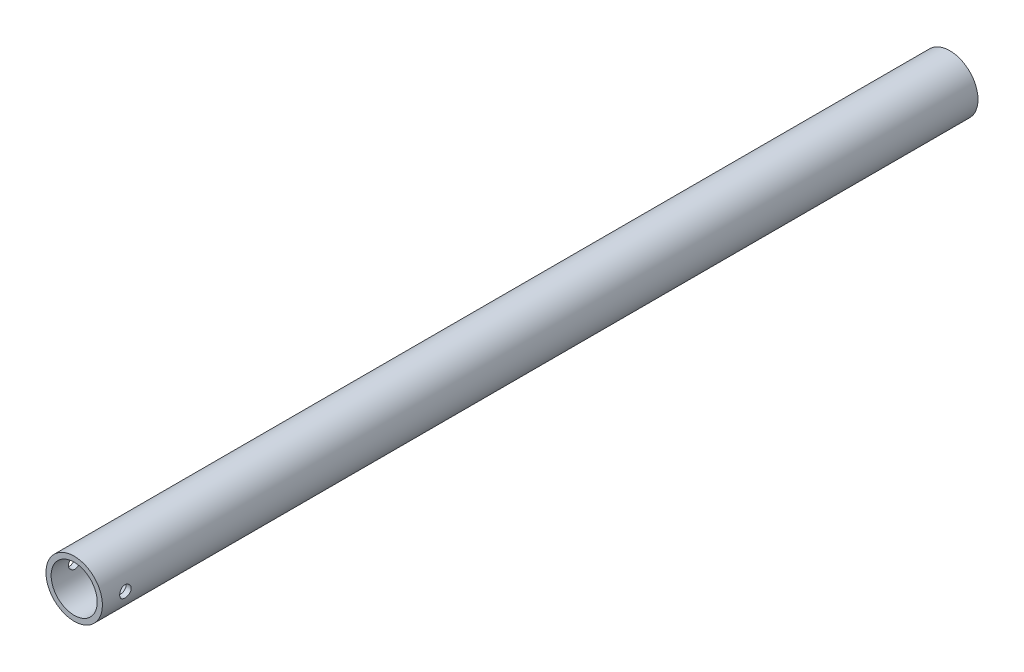
ISO-10303-21;
HEADER;
FILE_DESCRIPTION(('STEP AP214'),'2;1');
FILE_NAME('part.step','',(''),(''),'','','');
FILE_SCHEMA(('AUTOMOTIVE_DESIGN { 1 0 10303 214 1 1 1 1 }'));
ENDSEC;
DATA;
#1=APPLICATION_CONTEXT('core data for automotive mechanical design processes');
#2=APPLICATION_PROTOCOL_DEFINITION('international standard','automotive_design',2000,#1);
#3=PRODUCT_CONTEXT('',#1,'mechanical');
#4=PRODUCT('Part','Part','',(#3));
#5=PRODUCT_RELATED_PRODUCT_CATEGORY('part','',(#4));
#6=PRODUCT_DEFINITION_FORMATION('','',#4);
#7=PRODUCT_DEFINITION_CONTEXT('part definition',#1,'design');
#8=PRODUCT_DEFINITION('design','',#6,#7);
#9=PRODUCT_DEFINITION_SHAPE('','',#8);
#10=(LENGTH_UNIT() NAMED_UNIT(*) SI_UNIT(.MILLI.,.METRE.));
#11=(NAMED_UNIT(*) PLANE_ANGLE_UNIT() SI_UNIT($,.RADIAN.));
#12=(NAMED_UNIT(*) SI_UNIT($,.STERADIAN.) SOLID_ANGLE_UNIT());
#13=UNCERTAINTY_MEASURE_WITH_UNIT(LENGTH_MEASURE(1.E-05),#10,'distance_accuracy_value','');
#14=(GEOMETRIC_REPRESENTATION_CONTEXT(3) GLOBAL_UNCERTAINTY_ASSIGNED_CONTEXT((#13)) GLOBAL_UNIT_ASSIGNED_CONTEXT((#10,
#11,#12)) REPRESENTATION_CONTEXT('',''));
#15=CARTESIAN_POINT('',(0.,0.,0.));
#16=DIRECTION('',(0.,0.,1.));
#17=DIRECTION('',(1.,0.,0.));
#18=AXIS2_PLACEMENT_3D('',#15,#16,#17);
#19=CARTESIAN_POINT('',(-12.25,0.,370.));
#20=DIRECTION('',(1.,0.,0.));
#21=DIRECTION('',(0.,0.,-1.));
#22=AXIS2_PLACEMENT_3D('',#19,#20,#21);
#23=CYLINDRICAL_SURFACE('',#22,2.50000000000002);
#24=CARTESIAN_POINT('',(-10.,0.,367.5));
#25=CARTESIAN_POINT('',(-9.99999766446687,0.138126814449553,367.50000387623));
#26=CARTESIAN_POINT('',(-9.99710963553044,0.276296929717943,367.511485917956));
#27=CARTESIAN_POINT('',(-9.98586856383157,0.548677206284224,367.557041918845));
#28=CARTESIAN_POINT('',(-9.97751242366627,0.682885078117899,367.591128682563));
#29=CARTESIAN_POINT('',(-9.9562604388672,0.943368120304303,367.680732089104));
#30=CARTESIAN_POINT('',(-9.94337004736764,1.06965260571669,367.736222997859));
#31=CARTESIAN_POINT('',(-9.91442239679369,1.31112021984073,367.866968983408));
#32=CARTESIAN_POINT('',(-9.89836503090261,1.42630297391461,367.942224726865));
#33=CARTESIAN_POINT('',(-9.86445689319489,1.64466987883486,368.11200131609));
#34=CARTESIAN_POINT('',(-9.84657845246877,1.74759281676844,368.206852624932));
#35=CARTESIAN_POINT('',(-9.8112270019656,1.93624821200555,368.412420341515));
#36=CARTESIAN_POINT('',(-9.79375403816446,2.02197872824867,368.523138538245));
#37=CARTESIAN_POINT('',(-9.7609129283028,2.17504423799832,368.759325377895));
#38=CARTESIAN_POINT('',(-9.74557990774684,2.24208702654192,368.884988718015));
#39=CARTESIAN_POINT('',(-9.71915824696693,2.3539948475846,369.146247352767));
#40=CARTESIAN_POINT('',(-9.7080689282403,2.39886342573359,369.281841055553));
#41=CARTESIAN_POINT('',(-9.69167461160537,2.4642580613413,369.55623916367));
#42=CARTESIAN_POINT('',(-9.68625818328351,2.48525378055345,369.69492482673));
#43=CARTESIAN_POINT('',(-9.68148937432652,2.5037696251107,369.973947614999));
#44=CARTESIAN_POINT('',(-9.68213600713214,2.50129356969687,370.11428446782));
#45=CARTESIAN_POINT('',(-9.68932009194694,2.47331087439954,370.389026346242));
#46=CARTESIAN_POINT('',(-9.69571438345488,2.44836390031776,370.523492702442));
#47=CARTESIAN_POINT('',(-9.71344516118447,2.37704031150502,370.786268418185));
#48=CARTESIAN_POINT('',(-9.72478199948731,2.33066217011568,370.914577338382));
#49=CARTESIAN_POINT('',(-9.75125189842765,2.21731579656199,371.162896693754));
#50=CARTESIAN_POINT('',(-9.76642212449693,2.15014444538821,371.282810286316));
#51=CARTESIAN_POINT('',(-9.79882851409985,1.99726046002493,371.509864516261));
#52=CARTESIAN_POINT('',(-9.81606503891046,1.91154458134809,371.617002913446));
#53=CARTESIAN_POINT('',(-9.85126467566485,1.72110570780206,371.818672692824));
#54=CARTESIAN_POINT('',(-9.86923449130001,1.61591043027646,371.912757483436));
#55=CARTESIAN_POINT('',(-9.90343275964593,1.39101986250619,372.082035404107));
#56=CARTESIAN_POINT('',(-9.91966115915679,1.27132412951327,372.157227957106));
#57=CARTESIAN_POINT('',(-9.9486288682365,1.02019314780235,372.286750977041));
#58=CARTESIAN_POINT('',(-9.96135600212878,0.888718988681072,372.341008900424));
#59=CARTESIAN_POINT('',(-9.98179861652361,0.618126680238164,372.426528842849));
#60=CARTESIAN_POINT('',(-9.98951505565468,0.479009998584163,372.457795260697));
#61=CARTESIAN_POINT('',(-9.99892498785624,0.200899950650062,372.495762609265));
#62=CARTESIAN_POINT('',(-10.0007675584713,0.0619945333137,372.503071710126));
#63=CARTESIAN_POINT('',(-9.99864674690754,-0.215054791335833,372.494584996574));
#64=CARTESIAN_POINT('',(-9.99468388736421,-0.353198766074314,372.478791262001));
#65=CARTESIAN_POINT('',(-9.98149301878918,-0.622690447960808,372.425048486014));
#66=CARTESIAN_POINT('',(-9.97234390309647,-0.754108531614576,372.387431227538));
#67=CARTESIAN_POINT('',(-9.94981177723595,-1.00876215408752,372.291488193286));
#68=CARTESIAN_POINT('',(-9.93642833949965,-1.13199686505441,372.233160326145));
#69=CARTESIAN_POINT('',(-9.9065551321037,-1.3692052240497,372.096273118542));
#70=CARTESIAN_POINT('',(-9.89001445610999,-1.48297573639293,372.017373146006));
#71=CARTESIAN_POINT('',(-9.85574181979587,-1.69587768940551,371.842016818672));
#72=CARTESIAN_POINT('',(-9.83800965421578,-1.79500659828874,371.745557433971));
#73=CARTESIAN_POINT('',(-9.80281594932498,-1.97831761345414,371.534996731927));
#74=CARTESIAN_POINT('',(-9.78537173637463,-2.06207311270185,371.420520495001));
#75=CARTESIAN_POINT('',(-9.75321463970069,-2.20918459835606,371.178778942552));
#76=CARTESIAN_POINT('',(-9.7385016347494,-2.27254149026903,371.051514195049));
#77=CARTESIAN_POINT('',(-9.71363491194664,-2.37658570101226,370.788490462656));
#78=CARTESIAN_POINT('',(-9.70345425375808,-2.41740732773933,370.652787286146));
#79=CARTESIAN_POINT('',(-9.68877906706585,-2.47557609990492,370.376150603575));
#80=CARTESIAN_POINT('',(-9.68428329504044,-2.49292837912655,370.235218248298));
#81=CARTESIAN_POINT('',(-9.68158168701612,-2.50339765056085,369.956464960231));
#82=CARTESIAN_POINT('',(-9.68319887888034,-2.49719649630133,369.818670941456));
#83=CARTESIAN_POINT('',(-9.69213181672142,-2.46229546385369,369.546160185556));
#84=CARTESIAN_POINT('',(-9.69944744817731,-2.43359603781102,369.411443386645));
#85=CARTESIAN_POINT('',(-9.71885434473221,-2.35488553240499,369.149652568224));
#86=CARTESIAN_POINT('',(-9.73091692061056,-2.30500234113407,369.0225378246));
#87=CARTESIAN_POINT('',(-9.75846259540839,-2.18544152267506,368.778391028811));
#88=CARTESIAN_POINT('',(-9.77394616867808,-2.11576115005698,368.661360378022));
#89=CARTESIAN_POINT('',(-9.80709390439337,-1.9564462477286,368.437408951663));
#90=CARTESIAN_POINT('',(-9.82480441386302,-1.86633860485378,368.330831544293));
#91=CARTESIAN_POINT('',(-9.86013378743769,-1.66964895198292,368.134088258674));
#92=CARTESIAN_POINT('',(-9.87775262878421,-1.56306303543528,368.043926283145));
#93=CARTESIAN_POINT('',(-9.91129426079449,-1.33411264450436,367.880981152392));
#94=CARTESIAN_POINT('',(-9.92718055609783,-1.21149737052733,367.808542310547));
#95=CARTESIAN_POINT('',(-9.95508208291861,-0.955443432517467,367.685420895099));
#96=CARTESIAN_POINT('',(-9.96710008666301,-0.822012605727908,367.634722732252));
#97=CARTESIAN_POINT('',(-9.98413432609236,-0.574017088739125,367.564046949451));
#98=CARTESIAN_POINT('',(-9.99004308421151,-0.460633618180118,367.540081261578));
#99=CARTESIAN_POINT('',(-9.99797675386581,-0.23151011922714,367.50805676063));
#100=CARTESIAN_POINT('',(-10.0000019575149,-0.115770268737695,367.499996751158));
#101=CARTESIAN_POINT('',(-10.,0.,367.5));
#102=B_SPLINE_CURVE_WITH_KNOTS('',3,(#24,#25,#26,#27,#28,#29,#30,#31,#32,#33,#34,#35,#36,#37,
#38,#39,#40,#41,#42,#43,#44,#45,#46,#47,#48,#49,#50,#51,#52,#53,#54,#55,#56,#57,#58,#59,#60,#61,
#62,#63,#64,#65,#66,#67,#68,#69,#70,#71,#72,#73,#74,#75,#76,#77,#78,#79,#80,#81,#82,#83,#84,#85,
#86,#87,#88,#89,#90,#91,#92,#93,#94,#95,#96,#97,#98,#99,#100,#101),.UNSPECIFIED.,.T.,.F.,(4,2,2,
2,2,2,2,2,2,2,2,2,2,2,2,2,2,2,2,2,2,2,2,2,2,2,2,2,2,2,2,2,2,2,2,2,2,2,4),(0.,0.413956187453151,
0.828147062939834,1.24184150381019,1.65554990028223,2.07690725728567,2.49831215966771,
2.92597745909685,3.35357435282287,3.77260491835124,4.19156730193361,4.60037495017227,
5.00921172448936,5.42217546462006,5.83521151399143,6.26002501620572,6.68485149269282,
7.11113715020728,7.53734122819944,7.95263848254333,8.36789835193444,8.77700457528936,
9.18615212209359,9.60255979281124,10.0190393835224,10.44574182013,10.8724253125472,
11.2965375769765,11.7205570543049,12.1323963400749,12.5442273493653,12.9536066760888,
13.3630428023798,13.7831596069299,14.2033761629384,14.6312030917579,15.0587227304539,
15.4057040491339,15.7526592674821),.UNSPECIFIED.);
#103=CARTESIAN_POINT('',(-10.,0.,367.5));
#104=VERTEX_POINT('',#103);
#105=EDGE_CURVE('E83',#104,#104,#102,.T.);
#106=ORIENTED_EDGE('',*,*,#105,.T.);
#107=EDGE_LOOP('',(#106));
#108=FACE_BOUND('',#107,.T.);
#109=CARTESIAN_POINT('',(-12.25,0.,367.5));
#110=CARTESIAN_POINT('',(-12.2499974331662,0.138882036866379,367.500005036787));
#111=CARTESIAN_POINT('',(-12.2476139868117,0.277827137996631,367.511612029251));
#112=CARTESIAN_POINT('',(-12.2383359096847,0.551785865164239,367.557694074088));
#113=CARTESIAN_POINT('',(-12.2314377710084,0.68679634873933,367.592186908988));
#114=CARTESIAN_POINT('',(-12.2139001184754,0.948885610338763,367.682927425384));
#115=CARTESIAN_POINT('',(-12.2032642580711,1.0759719914998,367.739153868614));
#116=CARTESIAN_POINT('',(-12.1794056241417,1.31889949012093,367.871701501052));
#117=CARTESIAN_POINT('',(-12.1661829861179,1.43474119612755,367.948021637778));
#118=CARTESIAN_POINT('',(-12.1383966001883,1.6535291096108,368.11972843063));
#119=CARTESIAN_POINT('',(-12.1238180446415,1.75629430337891,368.215343359408));
#120=CARTESIAN_POINT('',(-12.0950699225029,1.94444422404693,368.422435001265));
#121=CARTESIAN_POINT('',(-12.0809003888451,2.02982755471302,368.533912987356));
#122=CARTESIAN_POINT('',(-12.0544297630792,2.18156644164199,368.770876017807));
#123=CARTESIAN_POINT('',(-12.0421477076396,2.24773345407774,368.896484111007));
#124=CARTESIAN_POINT('',(-12.0210534478607,2.35795326735896,369.157327351084));
#125=CARTESIAN_POINT('',(-12.0122408857538,2.40200834847335,369.29256150364));
#126=CARTESIAN_POINT('',(-11.9992334411267,2.46616385022899,369.566867066178));
#127=CARTESIAN_POINT('',(-11.9949772770028,2.4865824834849,369.705861085672));
#128=CARTESIAN_POINT('',(-11.9913801612558,2.50387410020574,369.98536215486));
#129=CARTESIAN_POINT('',(-11.9920386858373,2.50074959284037,370.125869041722));
#130=CARTESIAN_POINT('',(-11.9981409052103,2.47130064637297,370.402071422781));
#131=CARTESIAN_POINT('',(-12.0035091466479,2.44534201073773,370.537807835758));
#132=CARTESIAN_POINT('',(-12.0183070255688,2.37153953463982,370.802957683673));
#133=CARTESIAN_POINT('',(-12.0277368642096,2.32369461021395,370.932370805088));
#134=CARTESIAN_POINT('',(-12.0496719857962,2.2071312511424,371.182249248375));
#135=CARTESIAN_POINT('',(-12.0621983789723,2.13826874305518,371.302645432864));
#136=CARTESIAN_POINT('',(-12.0889017781055,1.98172654918874,371.530310407426));
#137=CARTESIAN_POINT('',(-12.1030789811558,1.89404461546885,371.637577626866));
#138=CARTESIAN_POINT('',(-12.1318128096775,1.70039864769435,371.838049543891));
#139=CARTESIAN_POINT('',(-12.1463715650748,1.59412264288532,371.930952849552));
#140=CARTESIAN_POINT('',(-12.1739849561022,1.36733961210755,372.097662459988));
#141=CARTESIAN_POINT('',(-12.1870395708848,1.24683238893984,372.17146850009));
#142=CARTESIAN_POINT('',(-12.2102079223289,0.994665934154817,372.297948163375));
#143=CARTESIAN_POINT('',(-12.2203167090751,0.862988406694695,372.350586273531));
#144=CARTESIAN_POINT('',(-12.2364170339747,0.592406601605036,372.432908826426));
#145=CARTESIAN_POINT('',(-12.2424090918321,0.453503238561763,372.462596166575));
#146=CARTESIAN_POINT('',(-12.2495281025886,0.175001688913503,372.497745309603));
#147=CARTESIAN_POINT('',(-12.2507378461175,0.0354575895981887,372.50361940942));
#148=CARTESIAN_POINT('',(-12.2483863122101,-0.242618095272731,372.492087199773));
#149=CARTESIAN_POINT('',(-12.2448253145551,-0.381149739724957,372.474682255515));
#150=CARTESIAN_POINT('',(-12.2333843161492,-0.651930427147325,372.417428434443));
#151=CARTESIAN_POINT('',(-12.2255452347947,-0.784226291045329,372.377792100256));
#152=CARTESIAN_POINT('',(-12.2064241259056,-1.04029369061016,372.277433655511));
#153=CARTESIAN_POINT('',(-12.1951418326096,-1.16406456737888,372.216709917289));
#154=CARTESIAN_POINT('',(-12.1701799568061,-1.40130027587801,372.075015407851));
#155=CARTESIAN_POINT('',(-12.1564717916737,-1.51461453319849,371.993797676496));
#156=CARTESIAN_POINT('',(-12.1282439887375,-1.72615381313618,371.813750159883));
#157=CARTESIAN_POINT('',(-12.1137242602082,-1.82437714410417,371.714918402821));
#158=CARTESIAN_POINT('',(-12.08522925552,-2.00454587047323,371.500568079629));
#159=CARTESIAN_POINT('',(-12.071266303433,-2.08620768144838,371.384809225379));
#160=CARTESIAN_POINT('',(-12.0457316403634,-2.22892965057385,371.140975762705));
#161=CARTESIAN_POINT('',(-12.0341598317365,-2.28999065004019,371.012901657498));
#162=CARTESIAN_POINT('',(-12.0148181812074,-2.3893956791335,370.748729457811));
#163=CARTESIAN_POINT('',(-12.0070282567749,-2.42785993606379,370.612678144556));
#164=CARTESIAN_POINT('',(-11.9960910717103,-2.48134188936211,370.33586676153));
#165=CARTESIAN_POINT('',(-11.9929431773415,-2.49636278626849,370.1951073372));
#166=CARTESIAN_POINT('',(-11.9916826683418,-2.50240938079958,369.91572503922));
#167=CARTESIAN_POINT('',(-11.9934759552458,-2.4938834895858,369.777112101813));
#168=CARTESIAN_POINT('',(-12.0016849651884,-2.45407088083554,369.503341132335));
#169=CARTESIAN_POINT('',(-12.0081006476445,-2.42278436312641,369.368183069942));
#170=CARTESIAN_POINT('',(-12.0247886760872,-2.33854222230424,369.105458761183));
#171=CARTESIAN_POINT('',(-12.0350508428206,-2.28564375961351,368.977873497628));
#172=CARTESIAN_POINT('',(-12.0582809536877,-2.15973169835964,368.733319599543));
#173=CARTESIAN_POINT('',(-12.0712491365445,-2.08671632491208,368.616351902996));
#174=CARTESIAN_POINT('',(-12.0987165755535,-1.92112086588276,368.394125236642));
#175=CARTESIAN_POINT('',(-12.1132388391228,-1.828217831454,368.289109716078));
#176=CARTESIAN_POINT('',(-12.1420153010616,-1.6261484759107,368.096010837072));
#177=CARTESIAN_POINT('',(-12.1562694370168,-1.51697841967674,368.007931378037));
#178=CARTESIAN_POINT('',(-12.1830883673864,-1.28403264756753,367.850288882215));
#179=CARTESIAN_POINT('',(-12.1956328974384,-1.16010974198772,367.780939743058));
#180=CARTESIAN_POINT('',(-12.2174190246969,-0.902145326804064,367.664161346756));
#181=CARTESIAN_POINT('',(-12.2266635541356,-0.768112928980516,367.616712618849));
#182=CARTESIAN_POINT('',(-12.2390427375682,-0.528177612537069,367.554118190776));
#183=CARTESIAN_POINT('',(-12.2431273725554,-0.423627081031692,367.533860576469));
#184=CARTESIAN_POINT('',(-12.2486069407729,-0.212729992973422,367.506799782568));
#185=CARTESIAN_POINT('',(-12.250001966192,-0.106383498104879,367.499996141827));
#186=CARTESIAN_POINT('',(-12.25,0.,367.5));
#187=B_SPLINE_CURVE_WITH_KNOTS('',3,(#109,#110,#111,#112,#113,#114,#115,#116,#117,#118,#119,
#120,#121,#122,#123,#124,#125,#126,#127,#128,#129,#130,#131,#132,#133,#134,#135,#136,#137,#138,
#139,#140,#141,#142,#143,#144,#145,#146,#147,#148,#149,#150,#151,#152,#153,#154,#155,#156,#157,
#158,#159,#160,#161,#162,#163,#164,#165,#166,#167,#168,#169,#170,#171,#172,#173,#174,#175,#176,
#177,#178,#179,#180,#181,#182,#183,#184,#185,#186),.UNSPECIFIED.,.T.,.F.,(4,2,2,2,2,2,2,2,2,2,2,
2,2,2,2,2,2,2,2,2,2,2,2,2,2,2,2,2,2,2,2,2,2,2,2,2,2,2,4),(0.,0.41625688167791,0.832837578431973,
1.24901221395369,1.66516505512855,2.08656509001953,2.50799896138789,2.93343796727557,
3.35883309120879,3.77843204246207,4.19798627452971,4.61093919994178,5.02391257990662,
5.43978297276927,5.85570306814549,6.27942186095357,6.70314652583235,7.12757912905877,
7.55195814122424,7.96895733674966,8.38593207833029,8.79898667575047,9.21207316250833,
9.63039738867343,10.0487684736154,10.4737902228438,10.8987946125178,11.3215167674338,
11.744181206355,12.158852461083,12.5735200752412,12.9870979820978,13.4007123899952,
13.8216362872931,14.242656983543,14.6682998368856,15.093563536139,15.4124268110268,
15.7312791563861),.UNSPECIFIED.);
#188=CARTESIAN_POINT('',(-12.25,0.,367.5));
#189=VERTEX_POINT('',#188);
#190=EDGE_CURVE('E10',#189,#189,#187,.T.);
#191=ORIENTED_EDGE('',*,*,#190,.F.);
#192=EDGE_LOOP('',(#191));
#193=FACE_BOUND('',#192,.T.);
#194=ADVANCED_FACE('F37',(#108,#193),#23,.F.);
#195=CARTESIAN_POINT('',(0.,0.,380.));
#196=DIRECTION('',(0.,0.,-1.));
#197=DIRECTION('',(-1.,0.,0.));
#198=AXIS2_PLACEMENT_3D('',#195,#196,#197);
#199=CYLINDRICAL_SURFACE('',#198,12.25);
#200=CARTESIAN_POINT('',(0.,-12.25,24.));
#201=CARTESIAN_POINT('',(0.218503573384227,-12.2499999992845,24.0000001586213));
#202=CARTESIAN_POINT('',(0.437008083407153,-12.2440994832162,23.9820375641672));
#203=CARTESIAN_POINT('',(0.867596289709362,-12.2211413176417,23.9108711160574));
#204=CARTESIAN_POINT('',(1.0796790560654,-12.2040820602625,23.8576621837116));
#205=CARTESIAN_POINT('',(1.491153511565,-12.1606633700251,23.7180107225387));
#206=CARTESIAN_POINT('',(1.69056528292381,-12.1343191100021,23.6316223923823));
#207=CARTESIAN_POINT('',(2.07207090079488,-12.075029682806,23.4283045872981));
#208=CARTESIAN_POINT('',(2.25416154337834,-12.0420832979106,23.3113694769898));
#209=CARTESIAN_POINT('',(2.60193715976738,-11.9718363084199,23.0461730840063));
#210=CARTESIAN_POINT('',(2.76696335867451,-11.9344344925772,22.8970748382826));
#211=CARTESIAN_POINT('',(3.07016792657621,-11.8600585337515,22.5735648285816));
#212=CARTESIAN_POINT('',(3.20834069797984,-11.8230844814431,22.3991478001178));
#213=CARTESIAN_POINT('',(3.45761350099737,-11.75264603703,22.0240965402395));
#214=CARTESIAN_POINT('',(3.56786832592426,-11.7193055169675,21.8228750571557));
#215=CARTESIAN_POINT('',(3.7526934669942,-11.6614424410162,21.4034812558663));
#216=CARTESIAN_POINT('',(3.82727417201803,-11.6369173184586,21.1853138941137));
#217=CARTESIAN_POINT('',(3.93618283421539,-11.6005252410056,20.745694061047));
#218=CARTESIAN_POINT('',(3.97174116965041,-11.5882725066277,20.5245792588837));
#219=CARTESIAN_POINT('',(4.00544129817996,-11.5766699680961,20.0792086951035));
#220=CARTESIAN_POINT('',(4.00359410480695,-11.5773163659731,19.8549538774528));
#221=CARTESIAN_POINT('',(3.9634932424289,-11.5911001633342,19.4200556264278));
#222=CARTESIAN_POINT('',(3.92683114841807,-11.6036914720393,19.2092451567052));
#223=CARTESIAN_POINT('',(3.82073229298362,-11.6390549387034,18.7969492548933));
#224=CARTESIAN_POINT('',(3.75129175539967,-11.6618282696414,18.5954649001335));
#225=CARTESIAN_POINT('',(3.58053827629056,-11.7153886066894,18.2038664563031));
#226=CARTESIAN_POINT('',(3.47874444103895,-11.7462952274093,18.0139791233901));
#227=CARTESIAN_POINT('',(3.24650777566288,-11.8125880782149,17.6534716689598));
#228=CARTESIAN_POINT('',(3.11605694196462,-11.8479755585819,17.4828569502618));
#229=CARTESIAN_POINT('',(2.82251007132288,-11.9214054067288,17.1567759992094));
#230=CARTESIAN_POINT('',(2.65810856131352,-11.9594920798946,17.0024926437711));
#231=CARTESIAN_POINT('',(2.30529509569677,-12.0324779128243,16.7233839801791));
#232=CARTESIAN_POINT('',(2.11688102199382,-12.0673767909329,16.5985612734579));
#233=CARTESIAN_POINT('',(1.71895855889472,-12.1304813179203,16.3810157626153));
#234=CARTESIAN_POINT('',(1.50927234490179,-12.1586225582843,16.2885982656502));
#235=CARTESIAN_POINT('',(1.07619284381971,-12.2045744779679,16.1407102345156));
#236=CARTESIAN_POINT('',(0.852804144784606,-12.222388594502,16.0852274063316));
#237=CARTESIAN_POINT('',(0.408683620780887,-12.2451151084418,16.0148523497324));
#238=CARTESIAN_POINT('',(0.188230872002318,-12.2505355438021,15.9983607804556));
#239=CARTESIAN_POINT('',(-0.252328583815222,-12.2493806089376,16.001896005612));
#240=CARTESIAN_POINT('',(-0.472435340891338,-12.2428071715882,16.0219169158675));
#241=CARTESIAN_POINT('',(-0.899731038810396,-12.2187379980351,16.0966368464797));
#242=CARTESIAN_POINT('',(-1.10710882785572,-12.2015485054147,16.1503641950628));
#243=CARTESIAN_POINT('',(-1.50983220581784,-12.1582876935628,16.28976678287));
#244=CARTESIAN_POINT('',(-1.70517627004501,-12.1322152515711,16.3754460607869));
#245=CARTESIAN_POINT('',(-2.08387879016142,-12.0730132537191,16.5787685431436));
#246=CARTESIAN_POINT('',(-2.26680021937837,-12.0397195574364,16.6971765973271));
#247=CARTESIAN_POINT('',(-2.61070285113447,-11.9698611100809,16.9616907110307));
#248=CARTESIAN_POINT('',(-2.77167757260494,-11.9332953980087,17.1078049221146));
#249=CARTESIAN_POINT('',(-3.07439861639738,-11.8590025138666,17.4311071910406));
#250=CARTESIAN_POINT('',(-3.21500390724192,-11.8212940092509,17.6093704720138));
#251=CARTESIAN_POINT('',(-3.464432787151,-11.7506199022056,17.9877752894706));
#252=CARTESIAN_POINT('',(-3.57325639587862,-11.7176542968416,18.1879168124183));
#253=CARTESIAN_POINT('',(-3.75546376524393,-11.6605376896547,18.6043018198589));
#254=CARTESIAN_POINT('',(-3.82894343765815,-11.6363628765812,18.8204998681576));
#255=CARTESIAN_POINT('',(-3.93814501789981,-11.5998660960184,19.263165880118));
#256=CARTESIAN_POINT('',(-3.97388303559325,-11.5875390715527,19.4896294189132));
#257=CARTESIAN_POINT('',(-4.00536254367542,-11.5766928895892,19.9343799522267));
#258=CARTESIAN_POINT('',(-4.00299040958446,-11.5775224789712,20.1525190864461));
#259=CARTESIAN_POINT('',(-3.96292999055854,-11.5912951900365,20.5851205133736));
#260=CARTESIAN_POINT('',(-3.92524364920382,-11.6042376450666,20.7995830077706));
#261=CARTESIAN_POINT('',(-3.81693649478577,-11.6403025633959,21.2150286194111));
#262=CARTESIAN_POINT('',(-3.7469028051635,-11.6632431523367,21.4161818120106));
#263=CARTESIAN_POINT('',(-3.57635977684286,-11.7166590110205,21.8040394793456));
#264=CARTESIAN_POINT('',(-3.47584385156976,-11.7471359089396,21.9907408203823));
#265=CARTESIAN_POINT('',(-3.24224064016835,-11.8137928157708,22.352923519545));
#266=CARTESIAN_POINT('',(-3.10795875420712,-11.8501591033381,22.5275999265934));
#267=CARTESIAN_POINT('',(-2.81268220223622,-11.9236923020771,22.8525497623744));
#268=CARTESIAN_POINT('',(-2.65168012278321,-11.9608594329434,23.0028163957238));
#269=CARTESIAN_POINT('',(-2.30040968588655,-12.0334491558326,23.2802458044598));
#270=CARTESIAN_POINT('',(-2.10928198602562,-12.068757118124,23.4063541174449));
#271=CARTESIAN_POINT('',(-1.70739661559304,-12.1321305622475,23.6245039009293));
#272=CARTESIAN_POINT('',(-1.49664490629713,-12.1601982337908,23.7165556749555));
#273=CARTESIAN_POINT('',(-1.07409041012309,-12.2045607650238,23.8591619025881));
#274=CARTESIAN_POINT('',(-0.863057031795571,-12.2214438535199,23.9118129066879));
#275=CARTESIAN_POINT('',(-0.434681684671786,-12.2441620913521,23.9822275186565));
#276=CARTESIAN_POINT('',(-0.217341305686309,-12.2500000007117,23.9999998422224));
#277=CARTESIAN_POINT('',(0.,-12.25,24.));
#278=B_SPLINE_CURVE_WITH_KNOTS('',3,(#200,#201,#202,#203,#204,#205,#206,#207,#208,#209,#210,
#211,#212,#213,#214,#215,#216,#217,#218,#219,#220,#221,#222,#223,#224,#225,#226,#227,#228,#229,
#230,#231,#232,#233,#234,#235,#236,#237,#238,#239,#240,#241,#242,#243,#244,#245,#246,#247,#248,
#249,#250,#251,#252,#253,#254,#255,#256,#257,#258,#259,#260,#261,#262,#263,#264,#265,#266,#267,
#268,#269,#270,#271,#272,#273,#274,#275,#276,#277),.UNSPECIFIED.,.T.,.F.,(4,2,2,2,2,2,2,2,2,2,2,
2,2,2,2,2,2,2,2,2,2,2,2,2,2,2,2,2,2,2,2,2,2,2,2,2,2,2,4),(0.,0.654711225666099,1.30951681004154,
1.96325728528139,2.61711845020316,3.29066055725454,3.96434291377256,4.65647792514057,
5.34841125269774,6.01783837870723,6.68706840417103,7.32710643539811,7.96721821864135,
8.61732831486756,9.2676202108144,9.95040480861107,10.6332496750775,11.322365260131,
12.0112513524358,12.6713497545673,13.3313417877788,13.9731308632744,14.6150010877958,
15.2733666117477,15.9319261380292,16.6191328391846,17.3063391151699,17.9916698693781,
18.6767079746641,19.3279472622024,19.9791507097325,20.618972759871,21.2589331608245,
21.9258757492848,22.5930036894065,23.2846964519745,23.9761797771016,24.627571246764,
25.2787999220202),.UNSPECIFIED.);
#279=CARTESIAN_POINT('',(0.,-12.25,24.));
#280=VERTEX_POINT('',#279);
#281=EDGE_CURVE('E101',#280,#280,#278,.T.);
#282=ORIENTED_EDGE('',*,*,#281,.T.);
#283=EDGE_LOOP('',(#282));
#284=FACE_BOUND('',#283,.T.);
#285=ORIENTED_EDGE('',*,*,#190,.T.);
#286=EDGE_LOOP('',(#285));
#287=FACE_BOUND('',#286,.T.);
#288=CARTESIAN_POINT('',(12.25,0.,367.5));
#289=CARTESIAN_POINT('',(12.2499974331662,-0.138882036866379,367.500005036787));
#290=CARTESIAN_POINT('',(12.2476139868117,-0.277827137996631,367.511612029251));
#291=CARTESIAN_POINT('',(12.2383359096847,-0.551785865164239,367.557694074088));
#292=CARTESIAN_POINT('',(12.2314377710084,-0.68679634873933,367.592186908988));
#293=CARTESIAN_POINT('',(12.2139001184754,-0.948885610338763,367.682927425384));
#294=CARTESIAN_POINT('',(12.2032642580711,-1.0759719914998,367.739153868614));
#295=CARTESIAN_POINT('',(12.1794056241417,-1.31889949012093,367.871701501052));
#296=CARTESIAN_POINT('',(12.1661829861179,-1.43474119612755,367.948021637778));
#297=CARTESIAN_POINT('',(12.1383966001883,-1.6535291096108,368.11972843063));
#298=CARTESIAN_POINT('',(12.1238180446415,-1.75629430337891,368.215343359408));
#299=CARTESIAN_POINT('',(12.0950699225029,-1.94444422404693,368.422435001265));
#300=CARTESIAN_POINT('',(12.0809003888451,-2.02982755471302,368.533912987356));
#301=CARTESIAN_POINT('',(12.0544297630792,-2.18156644164199,368.770876017807));
#302=CARTESIAN_POINT('',(12.0421477076396,-2.24773345407774,368.896484111007));
#303=CARTESIAN_POINT('',(12.0210534478607,-2.35795326735896,369.157327351084));
#304=CARTESIAN_POINT('',(12.0122408857538,-2.40200834847335,369.29256150364));
#305=CARTESIAN_POINT('',(11.9992334411267,-2.46616385022899,369.566867066178));
#306=CARTESIAN_POINT('',(11.9949772770028,-2.4865824834849,369.705861085672));
#307=CARTESIAN_POINT('',(11.9913801612558,-2.50387410020574,369.98536215486));
#308=CARTESIAN_POINT('',(11.9920386858373,-2.50074959284037,370.125869041722));
#309=CARTESIAN_POINT('',(11.9981409052103,-2.47130064637297,370.402071422781));
#310=CARTESIAN_POINT('',(12.0035091466479,-2.44534201073773,370.537807835758));
#311=CARTESIAN_POINT('',(12.0183070255688,-2.37153953463982,370.802957683673));
#312=CARTESIAN_POINT('',(12.0277368642096,-2.32369461021395,370.932370805088));
#313=CARTESIAN_POINT('',(12.0496719857962,-2.2071312511424,371.182249248375));
#314=CARTESIAN_POINT('',(12.0621983789723,-2.13826874305518,371.302645432864));
#315=CARTESIAN_POINT('',(12.0889017781055,-1.98172654918874,371.530310407426));
#316=CARTESIAN_POINT('',(12.1030789811558,-1.89404461546885,371.637577626866));
#317=CARTESIAN_POINT('',(12.1318128096775,-1.70039864769435,371.838049543891));
#318=CARTESIAN_POINT('',(12.1463715650748,-1.59412264288532,371.930952849552));
#319=CARTESIAN_POINT('',(12.1739849561022,-1.36733961210755,372.097662459988));
#320=CARTESIAN_POINT('',(12.1870395708848,-1.24683238893984,372.17146850009));
#321=CARTESIAN_POINT('',(12.2102079223289,-0.994665934154817,372.297948163375));
#322=CARTESIAN_POINT('',(12.2203167090751,-0.862988406694695,372.350586273531));
#323=CARTESIAN_POINT('',(12.2364170339747,-0.592406601605036,372.432908826426));
#324=CARTESIAN_POINT('',(12.2424090918321,-0.453503238561763,372.462596166575));
#325=CARTESIAN_POINT('',(12.2495281025886,-0.175001688913503,372.497745309603));
#326=CARTESIAN_POINT('',(12.2507378461175,-0.0354575895981887,372.50361940942));
#327=CARTESIAN_POINT('',(12.2483863122101,0.242618095272731,372.492087199773));
#328=CARTESIAN_POINT('',(12.2448253145551,0.381149739724957,372.474682255515));
#329=CARTESIAN_POINT('',(12.2333843161492,0.651930427147325,372.417428434443));
#330=CARTESIAN_POINT('',(12.2255452347947,0.784226291045329,372.377792100256));
#331=CARTESIAN_POINT('',(12.2064241259056,1.04029369061016,372.277433655511));
#332=CARTESIAN_POINT('',(12.1951418326096,1.16406456737888,372.216709917289));
#333=CARTESIAN_POINT('',(12.1701799568061,1.40130027587801,372.075015407851));
#334=CARTESIAN_POINT('',(12.1564717916737,1.51461453319849,371.993797676496));
#335=CARTESIAN_POINT('',(12.1282439887375,1.72615381313618,371.813750159883));
#336=CARTESIAN_POINT('',(12.1137242602082,1.82437714410417,371.714918402821));
#337=CARTESIAN_POINT('',(12.08522925552,2.00454587047323,371.500568079629));
#338=CARTESIAN_POINT('',(12.071266303433,2.08620768144838,371.384809225379));
#339=CARTESIAN_POINT('',(12.0457316403634,2.22892965057385,371.140975762705));
#340=CARTESIAN_POINT('',(12.0341598317365,2.28999065004019,371.012901657498));
#341=CARTESIAN_POINT('',(12.0148181812074,2.3893956791335,370.748729457811));
#342=CARTESIAN_POINT('',(12.0070282567749,2.42785993606379,370.612678144556));
#343=CARTESIAN_POINT('',(11.9960910717103,2.48134188936211,370.33586676153));
#344=CARTESIAN_POINT('',(11.9929431773415,2.49636278626849,370.1951073372));
#345=CARTESIAN_POINT('',(11.9916826683418,2.50240938079958,369.91572503922));
#346=CARTESIAN_POINT('',(11.9934759552458,2.4938834895858,369.777112101813));
#347=CARTESIAN_POINT('',(12.0016849651884,2.45407088083554,369.503341132335));
#348=CARTESIAN_POINT('',(12.0081006476445,2.42278436312641,369.368183069942));
#349=CARTESIAN_POINT('',(12.0247886760872,2.33854222230424,369.105458761183));
#350=CARTESIAN_POINT('',(12.0350508428206,2.28564375961351,368.977873497628));
#351=CARTESIAN_POINT('',(12.0582809536877,2.15973169835964,368.733319599543));
#352=CARTESIAN_POINT('',(12.0712491365445,2.08671632491208,368.616351902996));
#353=CARTESIAN_POINT('',(12.0987165755535,1.92112086588276,368.394125236642));
#354=CARTESIAN_POINT('',(12.1132388391228,1.828217831454,368.289109716078));
#355=CARTESIAN_POINT('',(12.1420153010616,1.6261484759107,368.096010837072));
#356=CARTESIAN_POINT('',(12.1562694370168,1.51697841967674,368.007931378037));
#357=CARTESIAN_POINT('',(12.1830883673864,1.28403264756753,367.850288882215));
#358=CARTESIAN_POINT('',(12.1956328974384,1.16010974198772,367.780939743058));
#359=CARTESIAN_POINT('',(12.2174190246969,0.902145326804064,367.664161346756));
#360=CARTESIAN_POINT('',(12.2266635541356,0.768112928980516,367.616712618849));
#361=CARTESIAN_POINT('',(12.2390427375682,0.528177612537069,367.554118190776));
#362=CARTESIAN_POINT('',(12.2431273725554,0.423627081031692,367.533860576469));
#363=CARTESIAN_POINT('',(12.2486069407729,0.212729992973422,367.506799782568));
#364=CARTESIAN_POINT('',(12.250001966192,0.106383498104879,367.499996141827));
#365=CARTESIAN_POINT('',(12.25,0.,367.5));
#366=B_SPLINE_CURVE_WITH_KNOTS('',3,(#288,#289,#290,#291,#292,#293,#294,#295,#296,#297,#298,
#299,#300,#301,#302,#303,#304,#305,#306,#307,#308,#309,#310,#311,#312,#313,#314,#315,#316,#317,
#318,#319,#320,#321,#322,#323,#324,#325,#326,#327,#328,#329,#330,#331,#332,#333,#334,#335,#336,
#337,#338,#339,#340,#341,#342,#343,#344,#345,#346,#347,#348,#349,#350,#351,#352,#353,#354,#355,
#356,#357,#358,#359,#360,#361,#362,#363,#364,#365),.UNSPECIFIED.,.T.,.F.,(4,2,2,2,2,2,2,2,2,2,2,
2,2,2,2,2,2,2,2,2,2,2,2,2,2,2,2,2,2,2,2,2,2,2,2,2,2,2,4),(0.,0.41625688167791,0.832837578431973,
1.24901221395369,1.66516505512855,2.08656509001953,2.50799896138789,2.93343796727557,
3.35883309120879,3.77843204246207,4.19798627452971,4.61093919994178,5.02391257990662,
5.43978297276927,5.85570306814549,6.27942186095357,6.70314652583235,7.12757912905877,
7.55195814122424,7.96895733674966,8.38593207833029,8.79898667575047,9.21207316250833,
9.63039738867343,10.0487684736154,10.4737902228438,10.8987946125178,11.3215167674338,
11.744181206355,12.158852461083,12.5735200752412,12.9870979820978,13.4007123899952,
13.8216362872931,14.242656983543,14.6682998368856,15.093563536139,15.4124268110268,
15.7312791563861),.UNSPECIFIED.);
#367=CARTESIAN_POINT('',(12.25,0.,367.5));
#368=VERTEX_POINT('',#367);
#369=EDGE_CURVE('E51',#368,#368,#366,.T.);
#370=ORIENTED_EDGE('',*,*,#369,.T.);
#371=EDGE_LOOP('',(#370));
#372=FACE_BOUND('',#371,.T.);
#373=CARTESIAN_POINT('',(0.,0.,380.));
#374=DIRECTION('',(0.,0.,1.));
#375=DIRECTION('',(1.,0.,0.));
#376=AXIS2_PLACEMENT_3D('',#373,#374,#375);
#377=CIRCLE('',#376,12.25);
#378=CARTESIAN_POINT('',(12.25,0.,380.));
#379=VERTEX_POINT('',#378);
#380=EDGE_CURVE('E56',#379,#379,#377,.T.);
#381=ORIENTED_EDGE('',*,*,#380,.F.);
#382=EDGE_LOOP('',(#381));
#383=FACE_BOUND('',#382,.T.);
#384=CARTESIAN_POINT('',(0.,0.,0.));
#385=DIRECTION('',(0.,0.,1.));
#386=DIRECTION('',(1.,0.,0.));
#387=AXIS2_PLACEMENT_3D('',#384,#385,#386);
#388=CIRCLE('',#387,12.25);
#389=CARTESIAN_POINT('',(12.25,0.,0.));
#390=VERTEX_POINT('',#389);
#391=EDGE_CURVE('E88',#390,#390,#388,.T.);
#392=ORIENTED_EDGE('',*,*,#391,.T.);
#393=EDGE_LOOP('',(#392));
#394=FACE_BOUND('',#393,.T.);
#395=ADVANCED_FACE('F39',(#284,#287,#372,#383,#394),#199,.T.);
#396=CARTESIAN_POINT('',(0.,0.,380.));
#397=DIRECTION('',(0.,0.,1.));
#398=DIRECTION('',(1.,0.,0.));
#399=AXIS2_PLACEMENT_3D('',#396,#397,#398);
#400=PLANE('',#399);
#401=CARTESIAN_POINT('',(0.,0.,380.));
#402=DIRECTION('',(0.,0.,1.));
#403=DIRECTION('',(1.,0.,0.));
#404=AXIS2_PLACEMENT_3D('',#401,#402,#403);
#405=CIRCLE('',#404,10.);
#406=CARTESIAN_POINT('',(10.,0.,380.));
#407=VERTEX_POINT('',#406);
#408=EDGE_CURVE('E96',#407,#407,#405,.T.);
#409=ORIENTED_EDGE('',*,*,#408,.F.);
#410=EDGE_LOOP('',(#409));
#411=FACE_BOUND('',#410,.T.);
#412=ORIENTED_EDGE('',*,*,#380,.T.);
#413=EDGE_LOOP('',(#412));
#414=FACE_BOUND('',#413,.T.);
#415=ADVANCED_FACE('F79',(#411,#414),#400,.T.);
#416=CARTESIAN_POINT('',(0.,0.,0.));
#417=DIRECTION('',(0.,0.,1.));
#418=DIRECTION('',(1.,0.,0.));
#419=AXIS2_PLACEMENT_3D('',#416,#417,#418);
#420=PLANE('',#419);
#421=CARTESIAN_POINT('',(0.,0.,0.));
#422=DIRECTION('',(0.,0.,1.));
#423=DIRECTION('',(1.,0.,0.));
#424=AXIS2_PLACEMENT_3D('',#421,#422,#423);
#425=CIRCLE('',#424,10.);
#426=CARTESIAN_POINT('',(10.,0.,0.));
#427=VERTEX_POINT('',#426);
#428=EDGE_CURVE('E93',#427,#427,#425,.T.);
#429=ORIENTED_EDGE('',*,*,#428,.T.);
#430=EDGE_LOOP('',(#429));
#431=FACE_BOUND('',#430,.T.);
#432=ORIENTED_EDGE('',*,*,#391,.F.);
#433=EDGE_LOOP('',(#432));
#434=FACE_BOUND('',#433,.T.);
#435=ADVANCED_FACE('F76',(#431,#434),#420,.F.);
#436=CARTESIAN_POINT('',(10.,0.,367.5));
#437=CARTESIAN_POINT('',(9.99999766446687,-0.138126814449553,367.50000387623));
#438=CARTESIAN_POINT('',(9.99710963553044,-0.276296929717943,367.511485917956));
#439=CARTESIAN_POINT('',(9.98586856383157,-0.548677206284224,367.557041918845));
#440=CARTESIAN_POINT('',(9.97751242366627,-0.682885078117899,367.591128682563));
#441=CARTESIAN_POINT('',(9.9562604388672,-0.943368120304303,367.680732089104));
#442=CARTESIAN_POINT('',(9.94337004736764,-1.06965260571669,367.736222997859));
#443=CARTESIAN_POINT('',(9.91442239679369,-1.31112021984073,367.866968983408));
#444=CARTESIAN_POINT('',(9.89836503090261,-1.42630297391461,367.942224726865));
#445=CARTESIAN_POINT('',(9.86445689319489,-1.64466987883486,368.11200131609));
#446=CARTESIAN_POINT('',(9.84657845246877,-1.74759281676844,368.206852624932));
#447=CARTESIAN_POINT('',(9.8112270019656,-1.93624821200555,368.412420341515));
#448=CARTESIAN_POINT('',(9.79375403816446,-2.02197872824867,368.523138538245));
#449=CARTESIAN_POINT('',(9.7609129283028,-2.17504423799832,368.759325377895));
#450=CARTESIAN_POINT('',(9.74557990774684,-2.24208702654192,368.884988718015));
#451=CARTESIAN_POINT('',(9.71915824696693,-2.3539948475846,369.146247352767));
#452=CARTESIAN_POINT('',(9.7080689282403,-2.39886342573359,369.281841055553));
#453=CARTESIAN_POINT('',(9.69167461160537,-2.4642580613413,369.55623916367));
#454=CARTESIAN_POINT('',(9.68625818328351,-2.48525378055345,369.69492482673));
#455=CARTESIAN_POINT('',(9.68148937432652,-2.5037696251107,369.973947614999));
#456=CARTESIAN_POINT('',(9.68213600713214,-2.50129356969687,370.11428446782));
#457=CARTESIAN_POINT('',(9.68932009194694,-2.47331087439954,370.389026346242));
#458=CARTESIAN_POINT('',(9.69571438345488,-2.44836390031776,370.523492702442));
#459=CARTESIAN_POINT('',(9.71344516118447,-2.37704031150502,370.786268418185));
#460=CARTESIAN_POINT('',(9.72478199948731,-2.33066217011568,370.914577338382));
#461=CARTESIAN_POINT('',(9.75125189842765,-2.21731579656199,371.162896693754));
#462=CARTESIAN_POINT('',(9.76642212449693,-2.15014444538821,371.282810286316));
#463=CARTESIAN_POINT('',(9.79882851409985,-1.99726046002493,371.509864516261));
#464=CARTESIAN_POINT('',(9.81606503891046,-1.91154458134809,371.617002913446));
#465=CARTESIAN_POINT('',(9.85126467566485,-1.72110570780206,371.818672692824));
#466=CARTESIAN_POINT('',(9.86923449130001,-1.61591043027646,371.912757483436));
#467=CARTESIAN_POINT('',(9.90343275964593,-1.39101986250619,372.082035404107));
#468=CARTESIAN_POINT('',(9.91966115915679,-1.27132412951327,372.157227957106));
#469=CARTESIAN_POINT('',(9.9486288682365,-1.02019314780235,372.286750977041));
#470=CARTESIAN_POINT('',(9.96135600212878,-0.888718988681072,372.341008900424));
#471=CARTESIAN_POINT('',(9.98179861652361,-0.618126680238164,372.426528842849));
#472=CARTESIAN_POINT('',(9.98951505565468,-0.479009998584163,372.457795260697));
#473=CARTESIAN_POINT('',(9.99892498785624,-0.200899950650062,372.495762609265));
#474=CARTESIAN_POINT('',(10.0007675584713,-0.0619945333137,372.503071710126));
#475=CARTESIAN_POINT('',(9.99864674690754,0.215054791335833,372.494584996574));
#476=CARTESIAN_POINT('',(9.99468388736421,0.353198766074314,372.478791262001));
#477=CARTESIAN_POINT('',(9.98149301878918,0.622690447960808,372.425048486014));
#478=CARTESIAN_POINT('',(9.97234390309647,0.754108531614576,372.387431227538));
#479=CARTESIAN_POINT('',(9.94981177723595,1.00876215408752,372.291488193286));
#480=CARTESIAN_POINT('',(9.93642833949965,1.13199686505441,372.233160326145));
#481=CARTESIAN_POINT('',(9.9065551321037,1.3692052240497,372.096273118542));
#482=CARTESIAN_POINT('',(9.89001445610999,1.48297573639293,372.017373146006));
#483=CARTESIAN_POINT('',(9.85574181979587,1.69587768940551,371.842016818672));
#484=CARTESIAN_POINT('',(9.83800965421578,1.79500659828874,371.745557433971));
#485=CARTESIAN_POINT('',(9.80281594932498,1.97831761345414,371.534996731927));
#486=CARTESIAN_POINT('',(9.78537173637463,2.06207311270185,371.420520495001));
#487=CARTESIAN_POINT('',(9.75321463970069,2.20918459835606,371.178778942552));
#488=CARTESIAN_POINT('',(9.7385016347494,2.27254149026903,371.051514195049));
#489=CARTESIAN_POINT('',(9.71363491194664,2.37658570101226,370.788490462656));
#490=CARTESIAN_POINT('',(9.70345425375808,2.41740732773933,370.652787286146));
#491=CARTESIAN_POINT('',(9.68877906706585,2.47557609990492,370.376150603575));
#492=CARTESIAN_POINT('',(9.68428329504044,2.49292837912655,370.235218248298));
#493=CARTESIAN_POINT('',(9.68158168701612,2.50339765056085,369.956464960231));
#494=CARTESIAN_POINT('',(9.68319887888034,2.49719649630133,369.818670941456));
#495=CARTESIAN_POINT('',(9.69213181672142,2.46229546385369,369.546160185556));
#496=CARTESIAN_POINT('',(9.69944744817731,2.43359603781102,369.411443386645));
#497=CARTESIAN_POINT('',(9.71885434473221,2.35488553240499,369.149652568224));
#498=CARTESIAN_POINT('',(9.73091692061056,2.30500234113407,369.0225378246));
#499=CARTESIAN_POINT('',(9.75846259540839,2.18544152267506,368.778391028811));
#500=CARTESIAN_POINT('',(9.77394616867808,2.11576115005698,368.661360378022));
#501=CARTESIAN_POINT('',(9.80709390439337,1.9564462477286,368.437408951663));
#502=CARTESIAN_POINT('',(9.82480441386302,1.86633860485378,368.330831544293));
#503=CARTESIAN_POINT('',(9.86013378743769,1.66964895198292,368.134088258674));
#504=CARTESIAN_POINT('',(9.87775262878421,1.56306303543528,368.043926283145));
#505=CARTESIAN_POINT('',(9.91129426079449,1.33411264450436,367.880981152392));
#506=CARTESIAN_POINT('',(9.92718055609783,1.21149737052733,367.808542310547));
#507=CARTESIAN_POINT('',(9.95508208291861,0.955443432517467,367.685420895099));
#508=CARTESIAN_POINT('',(9.96710008666301,0.822012605727908,367.634722732252));
#509=CARTESIAN_POINT('',(9.98413432609236,0.574017088739125,367.564046949451));
#510=CARTESIAN_POINT('',(9.99004308421151,0.460633618180118,367.540081261578));
#511=CARTESIAN_POINT('',(9.99797675386581,0.23151011922714,367.50805676063));
#512=CARTESIAN_POINT('',(10.0000019575149,0.115770268737695,367.499996751158));
#513=CARTESIAN_POINT('',(10.,0.,367.5));
#514=B_SPLINE_CURVE_WITH_KNOTS('',3,(#436,#437,#438,#439,#440,#441,#442,#443,#444,#445,#446,
#447,#448,#449,#450,#451,#452,#453,#454,#455,#456,#457,#458,#459,#460,#461,#462,#463,#464,#465,
#466,#467,#468,#469,#470,#471,#472,#473,#474,#475,#476,#477,#478,#479,#480,#481,#482,#483,#484,
#485,#486,#487,#488,#489,#490,#491,#492,#493,#494,#495,#496,#497,#498,#499,#500,#501,#502,#503,
#504,#505,#506,#507,#508,#509,#510,#511,#512,#513),.UNSPECIFIED.,.T.,.F.,(4,2,2,2,2,2,2,2,2,2,2,
2,2,2,2,2,2,2,2,2,2,2,2,2,2,2,2,2,2,2,2,2,2,2,2,2,2,2,4),(0.,0.413956187453151,
0.828147062939834,1.24184150381019,1.65554990028223,2.07690725728567,2.49831215966771,
2.92597745909685,3.35357435282287,3.77260491835124,4.19156730193361,4.60037495017227,
5.00921172448936,5.42217546462006,5.83521151399143,6.26002501620572,6.68485149269282,
7.11113715020728,7.53734122819944,7.95263848254333,8.36789835193444,8.77700457528936,
9.18615212209359,9.60255979281124,10.0190393835224,10.44574182013,10.8724253125472,
11.2965375769765,11.7205570543049,12.1323963400749,12.5442273493653,12.9536066760888,
13.3630428023798,13.7831596069299,14.2033761629384,14.6312030917579,15.0587227304539,
15.4057040491339,15.7526592674821),.UNSPECIFIED.);
#515=CARTESIAN_POINT('',(10.,0.,367.5));
#516=VERTEX_POINT('',#515);
#517=EDGE_CURVE('E67',#516,#516,#514,.T.);
#518=ORIENTED_EDGE('',*,*,#517,.T.);
#519=EDGE_LOOP('',(#518));
#520=FACE_BOUND('',#519,.T.);
#521=ORIENTED_EDGE('',*,*,#369,.F.);
#522=EDGE_LOOP('',(#521));
#523=FACE_BOUND('',#522,.T.);
#524=ADVANCED_FACE('F71',(#520,#523),#23,.F.);
#525=CARTESIAN_POINT('',(0.,0.,0.));
#526=DIRECTION('',(0.,0.,1.));
#527=DIRECTION('',(1.,0.,0.));
#528=AXIS2_PLACEMENT_3D('',#525,#526,#527);
#529=CYLINDRICAL_SURFACE('',#528,10.);
#530=CARTESIAN_POINT('',(0.,-10.,24.));
#531=CARTESIAN_POINT('',(-0.107549581345536,-9.99999886871264,23.9999984250671));
#532=CARTESIAN_POINT('',(-0.215132147940361,-9.99825999367799,23.9956563289198));
#533=CARTESIAN_POINT('',(-0.429535200549548,-9.99134740691108,23.9783266172161));
#534=CARTESIAN_POINT('',(-0.536355162703301,-9.98617152790588,23.9653335465974));
#535=CARTESIAN_POINT('',(-0.748635856497416,-9.97250573560117,23.9307919654494));
#536=CARTESIAN_POINT('',(-0.854093134440869,-9.96400865312144,23.9092249453802));
#537=CARTESIAN_POINT('',(-1.0626676111401,-9.94393017211574,23.8577582695632));
#538=CARTESIAN_POINT('',(-1.16578384227259,-9.932347522545,23.8278552337447));
#539=CARTESIAN_POINT('',(-1.46979509681069,-9.89349112162205,23.726277191284));
#540=CARTESIAN_POINT('',(-1.66629107461992,-9.86204458846134,23.6425781809936));
#541=CARTESIAN_POINT('',(-2.04217417878101,-9.79113035538708,23.4459537826502));
#542=CARTESIAN_POINT('',(-2.22156721456798,-9.75166544086262,23.3330385398851));
#543=CARTESIAN_POINT('',(-2.56699339938209,-9.66661825353092,23.0755312454783));
#544=CARTESIAN_POINT('',(-2.73212223266508,-9.62084608086599,22.9297872894244));
#545=CARTESIAN_POINT('',(-3.03635232313263,-9.52921139577231,22.613199390848));
#546=CARTESIAN_POINT('',(-3.17544084661153,-9.48334885017047,22.4423432409835));
#547=CARTESIAN_POINT('',(-3.42974847409894,-9.39445587657958,22.0711440314337));
#548=CARTESIAN_POINT('',(-3.54362978572887,-9.35164233015934,21.8698270739363));
#549=CARTESIAN_POINT('',(-3.73550961465234,-9.2766729328807,21.4489271571991));
#550=CARTESIAN_POINT('',(-3.81352517485723,-9.24451202207146,21.2293529322586));
#551=CARTESIAN_POINT('',(-3.92779760260541,-9.19652715590089,20.7885753443142));
#552=CARTESIAN_POINT('',(-3.96578791979826,-9.18002840771385,20.5678975319119));
#553=CARTESIAN_POINT('',(-4.00434593508728,-9.16328008038143,20.1227300003227));
#554=CARTESIAN_POINT('',(-4.00493203570086,-9.16302251073203,19.8982422099889));
#555=CARTESIAN_POINT('',(-3.9699787321474,-9.17821000534301,19.4684866577768));
#556=CARTESIAN_POINT('',(-3.93695062778272,-9.19256349925666,19.2629685712344));
#557=CARTESIAN_POINT('',(-3.83989376129508,-9.23352375055553,18.8606808876497));
#558=CARTESIAN_POINT('',(-3.77585958980135,-9.26013264599921,18.6639128236937));
#559=CARTESIAN_POINT('',(-3.6173894649114,-9.32318970221162,18.2799643277081));
#560=CARTESIAN_POINT('',(-3.52235972457939,-9.35982758573424,18.0930615219175));
#561=CARTESIAN_POINT('',(-3.30501292151569,-9.43876232767927,17.73716836725));
#562=CARTESIAN_POINT('',(-3.1826856102159,-9.48106130910411,17.5681847811869));
#563=CARTESIAN_POINT('',(-2.90310119889356,-9.57053473488081,17.239180542404));
#564=CARTESIAN_POINT('',(-2.74387492593717,-9.61783329953252,17.0808625411101));
#565=CARTESIAN_POINT('',(-2.40062885486449,-9.70919649915615,16.7926310439938));
#566=CARTESIAN_POINT('',(-2.21660413066998,-9.75326048890393,16.6627232051788));
#567=CARTESIAN_POINT('',(-1.82415530521056,-9.83429362529358,16.4327651051689));
#568=CARTESIAN_POINT('',(-1.61532098269266,-9.87110540190899,16.3333554376061));
#569=CARTESIAN_POINT('',(-1.18204753096606,-9.93229656657448,16.1716642778437));
#570=CARTESIAN_POINT('',(-0.957616393699401,-9.95668226924746,16.1093639248851));
#571=CARTESIAN_POINT('',(-0.513791775215592,-9.98912279013839,16.0271034091606));
#572=CARTESIAN_POINT('',(-0.294886587971142,-9.99805891667034,16.0048550914929));
#573=CARTESIAN_POINT('',(0.143690619615706,-10.0013695702126,15.9965737989427));
#574=CARTESIAN_POINT('',(0.363362426448183,-9.99574787164577,16.0105314369048));
#575=CARTESIAN_POINT('',(0.786865478243655,-9.97115134127512,16.0725835051041));
#576=CARTESIAN_POINT('',(0.990964983549762,-9.95278782691064,16.1191159607025));
#577=CARTESIAN_POINT('',(1.38827085612275,-9.90518882810983,16.242871416619));
#578=CARTESIAN_POINT('',(1.58147582045412,-9.87595194712999,16.3200983593352));
#579=CARTESIAN_POINT('',(1.95815757162884,-9.80833189541687,16.5055698793621));
#580=CARTESIAN_POINT('',(2.14115604549353,-9.76969631959847,16.6146909440947));
#581=CARTESIAN_POINT('',(2.4868871825104,-9.68746729490809,16.8598806478029));
#582=CARTESIAN_POINT('',(2.64961168158684,-9.64387186219643,16.9959600858139));
#583=CARTESIAN_POINT('',(2.96144608598878,-9.55290235277181,17.3017400259326));
#584=CARTESIAN_POINT('',(3.10894786734725,-9.50546882853787,17.4730670831409));
#585=CARTESIAN_POINT('',(3.37350239509234,-9.4148334583058,17.8388801658903));
#586=CARTESIAN_POINT('',(3.4905501236659,-9.37163231039242,18.0333700001994));
#587=CARTESIAN_POINT('',(3.69161500286277,-9.2942859982933,18.4429233896733));
#588=CARTESIAN_POINT('',(3.77530118531766,-9.26023261821741,18.6581680002435));
#589=CARTESIAN_POINT('',(3.90459244315908,-9.20647346903737,19.1014673016128));
#590=CARTESIAN_POINT('',(3.95022562452798,-9.18675711197461,19.3295124048418));
#591=CARTESIAN_POINT('',(3.99943122157417,-9.16543518780389,19.774255809844));
#592=CARTESIAN_POINT('',(4.0057941177721,-9.16262842667612,19.990589701895));
#593=CARTESIAN_POINT('',(3.98360636538274,-9.17229671415009,20.4210896927211));
#594=CARTESIAN_POINT('',(3.9550601501471,-9.18476982225497,20.6352560632825));
#595=CARTESIAN_POINT('',(3.86614256488129,-9.2225330048627,21.0466644608903));
#596=CARTESIAN_POINT('',(3.80707437387706,-9.2472967218297,21.2442408462211));
#597=CARTESIAN_POINT('',(3.66001151041638,-9.30647993934966,21.6267569617897));
#598=CARTESIAN_POINT('',(3.5720088493455,-9.34090210615105,21.8116931851113));
#599=CARTESIAN_POINT('',(3.36374310804133,-9.41797252826471,22.1752204107095));
#600=CARTESIAN_POINT('',(3.24192140926543,-9.46097893410836,22.3528418306883));
#601=CARTESIAN_POINT('',(2.97179350239177,-9.54927479921251,22.6859821426248));
#602=CARTESIAN_POINT('',(2.82347931168581,-9.59456494363941,22.84149434729));
#603=CARTESIAN_POINT('',(2.492974124467,-9.68587647140964,23.1364235925306));
#604=CARTESIAN_POINT('',(2.30921017071955,-9.73175488236393,23.2741433839823));
#605=CARTESIAN_POINT('',(2.01716584575533,-9.7949502762577,23.4560481089375));
#606=CARTESIAN_POINT('',(1.91699501972425,-9.81509269692655,23.512607063853));
#607=CARTESIAN_POINT('',(1.7118011098248,-9.85294835133019,23.6170379954053));
#608=CARTESIAN_POINT('',(1.60678027559742,-9.87066269647665,23.664913949808));
#609=CARTESIAN_POINT('',(1.39454646904328,-9.9028559935491,23.750747984685));
#610=CARTESIAN_POINT('',(1.28740777135871,-9.91738778532477,23.7888701547472));
#611=CARTESIAN_POINT('',(1.06995577523383,-9.94319722915714,23.8559213477213));
#612=CARTESIAN_POINT('',(0.959643983352616,-9.95447639837582,23.8848546573499));
#613=CARTESIAN_POINT('',(0.736945215856833,-9.97343330649399,23.933174836149));
#614=CARTESIAN_POINT('',(0.624564263591278,-9.98112017494336,23.952585911645));
#615=CARTESIAN_POINT('',(0.398419132407602,-9.99270031578293,23.9817385706662));
#616=CARTESIAN_POINT('',(0.284655994966352,-9.99659628445551,23.9914870268343));
#617=CARTESIAN_POINT('',(0.113830463425492,-9.99951445883957,23.9987858955735));
#618=CARTESIAN_POINT('',(0.0569198512645299,-10.0000005987258,24.0000008335221));
#619=CARTESIAN_POINT('',(0.,-10.,24.));
#620=B_SPLINE_CURVE_WITH_KNOTS('',3,(#530,#531,#532,#533,#534,#535,#536,#537,#538,#539,#540,
#541,#542,#543,#544,#545,#546,#547,#548,#549,#550,#551,#552,#553,#554,#555,#556,#557,#558,#559,
#560,#561,#562,#563,#564,#565,#566,#567,#568,#569,#570,#571,#572,#573,#574,#575,#576,#577,#578,
#579,#580,#581,#582,#583,#584,#585,#586,#587,#588,#589,#590,#591,#592,#593,#594,#595,#596,#597,
#598,#599,#600,#601,#602,#603,#604,#605,#606,#607,#608,#609,#610,#611,#612,#613,#614,#615,#616,
#617,#618,#619),.UNSPECIFIED.,.T.,.F.,(4,2,2,2,2,2,2,2,2,2,2,2,2,2,2,2,2,2,2,2,2,2,2,2,2,2,2,2,
2,2,2,2,2,2,2,2,2,2,2,2,2,2,2,2,4),(0.,0.322603993422155,0.645411604786482,0.968919914471235,
1.29255959093094,1.93701523385824,2.58124739027476,3.25313995292302,3.9253602176033,
4.62749749529941,5.32930078128043,5.99927442509165,6.66891844572483,7.29195888698823,
7.9151080641227,8.55097484497807,9.18708075776542,9.87235930273289,10.5577741757964,
11.2567305822579,11.9553314412776,12.6125760095619,13.2696501904034,13.8972014302891,
14.5248332988777,15.171662586967,15.8187515089811,16.50856181149,17.1984856998767,
17.8950932218183,18.5911857719204,19.2371857868567,19.8831037702627,20.5034786899771,
21.124025035105,21.7801016801356,22.4363763459696,23.1352007896785,23.4851924266232,
23.8350233218042,24.1785111324565,24.52183846562,24.8642884495951,25.2064946871486,
25.3772305569977),.UNSPECIFIED.);
#621=CARTESIAN_POINT('',(0.,-10.,24.));
#622=VERTEX_POINT('',#621);
#623=EDGE_CURVE('E42',#622,#622,#620,.T.);
#624=ORIENTED_EDGE('',*,*,#623,.T.);
#625=EDGE_LOOP('',(#624));
#626=FACE_BOUND('',#625,.T.);
#627=ORIENTED_EDGE('',*,*,#517,.F.);
#628=EDGE_LOOP('',(#627));
#629=FACE_BOUND('',#628,.T.);
#630=ORIENTED_EDGE('',*,*,#428,.F.);
#631=EDGE_LOOP('',(#630));
#632=FACE_BOUND('',#631,.T.);
#633=ORIENTED_EDGE('',*,*,#408,.T.);
#634=EDGE_LOOP('',(#633));
#635=FACE_BOUND('',#634,.T.);
#636=ORIENTED_EDGE('',*,*,#105,.F.);
#637=EDGE_LOOP('',(#636));
#638=FACE_BOUND('',#637,.T.);
#639=ADVANCED_FACE('F75',(#626,#629,#632,#635,#638),#529,.F.);
#640=CARTESIAN_POINT('',(0.,-12.25,20.));
#641=DIRECTION('',(0.,1.,0.));
#642=DIRECTION('',(0.,0.,1.));
#643=AXIS2_PLACEMENT_3D('',#640,#641,#642);
#644=CYLINDRICAL_SURFACE('',#643,4.);
#645=ORIENTED_EDGE('',*,*,#623,.F.);
#646=EDGE_LOOP('',(#645));
#647=FACE_BOUND('',#646,.T.);
#648=ORIENTED_EDGE('',*,*,#281,.F.);
#649=EDGE_LOOP('',(#648));
#650=FACE_BOUND('',#649,.T.);
#651=ADVANCED_FACE('F157',(#647,#650),#644,.F.);
#652=CLOSED_SHELL('',(#194,#395,#415,#435,#524,#639,#651));
#653=MANIFOLD_SOLID_BREP('B2',#652);
#654=ADVANCED_BREP_SHAPE_REPRESENTATION('',(#18,#653),#14);
#655=SHAPE_DEFINITION_REPRESENTATION(#9,#654);
ENDSEC;
END-ISO-10303-21;
